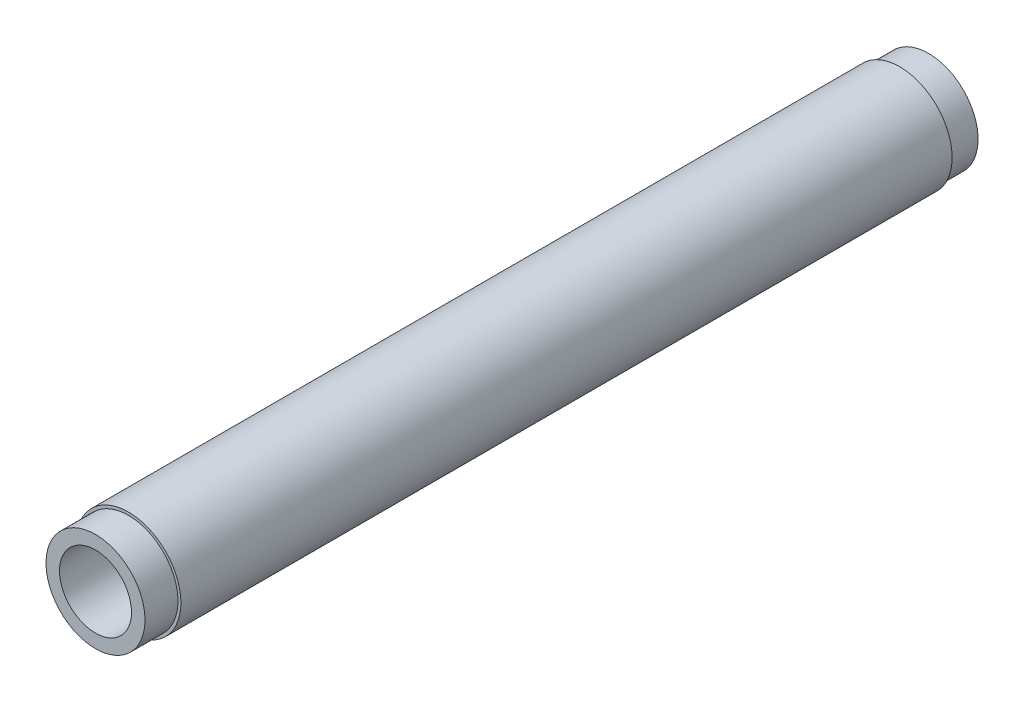
ISO-10303-21;
HEADER;
FILE_DESCRIPTION(('STEP AP214'),'2;1');
FILE_NAME('part.step','',(''),(''),'','','');
FILE_SCHEMA(('AUTOMOTIVE_DESIGN { 1 0 10303 214 1 1 1 1 }'));
ENDSEC;
DATA;
#1=APPLICATION_CONTEXT('core data for automotive mechanical design processes');
#2=APPLICATION_PROTOCOL_DEFINITION('international standard','automotive_design',2000,#1);
#3=PRODUCT_CONTEXT('',#1,'mechanical');
#4=PRODUCT('Part','Part','',(#3));
#5=PRODUCT_RELATED_PRODUCT_CATEGORY('part','',(#4));
#6=PRODUCT_DEFINITION_FORMATION('','',#4);
#7=PRODUCT_DEFINITION_CONTEXT('part definition',#1,'design');
#8=PRODUCT_DEFINITION('design','',#6,#7);
#9=PRODUCT_DEFINITION_SHAPE('','',#8);
#10=(LENGTH_UNIT() NAMED_UNIT(*) SI_UNIT(.MILLI.,.METRE.));
#11=(NAMED_UNIT(*) PLANE_ANGLE_UNIT() SI_UNIT($,.RADIAN.));
#12=(NAMED_UNIT(*) SI_UNIT($,.STERADIAN.) SOLID_ANGLE_UNIT());
#13=UNCERTAINTY_MEASURE_WITH_UNIT(LENGTH_MEASURE(1.E-05),#10,'distance_accuracy_value','');
#14=(GEOMETRIC_REPRESENTATION_CONTEXT(3) GLOBAL_UNCERTAINTY_ASSIGNED_CONTEXT((#13)) GLOBAL_UNIT_ASSIGNED_CONTEXT((#10,
#11,#12)) REPRESENTATION_CONTEXT('',''));
#15=CARTESIAN_POINT('',(0.,0.,0.));
#16=DIRECTION('',(0.,0.,1.));
#17=DIRECTION('',(1.,0.,0.));
#18=AXIS2_PLACEMENT_3D('',#15,#16,#17);
#19=CARTESIAN_POINT('',(159.099025767245,159.099025766711,45.));
#20=DIRECTION('',(0.,0.,-1.));
#21=DIRECTION('',(-1.,0.,0.));
#22=AXIS2_PLACEMENT_3D('',#19,#20,#21);
#23=CYLINDRICAL_SURFACE('',#22,6.00000000000002);
#24=CARTESIAN_POINT('',(159.099025767245,159.099025766711,45.));
#25=DIRECTION('',(0.,0.,1.));
#26=DIRECTION('',(1.,0.,0.));
#27=AXIS2_PLACEMENT_3D('',#24,#25,#26);
#28=CIRCLE('',#27,6.00000000000002);
#29=CARTESIAN_POINT('',(153.099025767245,159.099025766711,45.));
#30=VERTEX_POINT('',#29);
#31=EDGE_CURVE('E37',#30,#30,#28,.T.);
#32=CARTESIAN_POINT('',(159.099025767245,159.099025766711,41.));
#33=DIRECTION('',(0.,0.,-1.));
#34=DIRECTION('',(-1.,0.,0.));
#35=AXIS2_PLACEMENT_3D('',#32,#33,#34);
#36=CIRCLE('',#35,6.00000000000002);
#37=CARTESIAN_POINT('',(153.099025767245,159.099025766711,41.));
#38=VERTEX_POINT('',#37);
#39=EDGE_CURVE('E10',#38,#38,#36,.T.);
#40=CARTESIAN_POINT('',(153.099025767245,159.099025766711,45.));
#41=CARTESIAN_POINT('',(153.099025767245,159.099025766711,44.9583333333333));
#42=CARTESIAN_POINT('',(153.099025767245,159.099025766711,44.9166666666667));
#43=CARTESIAN_POINT('',(153.099025767245,159.099025766711,44.8333333333333));
#44=CARTESIAN_POINT('',(153.099025767245,159.099025766711,44.7916666666667));
#45=CARTESIAN_POINT('',(153.099025767245,159.099025766711,44.7083333333333));
#46=CARTESIAN_POINT('',(153.099025767245,159.099025766711,44.6666666666667));
#47=CARTESIAN_POINT('',(153.099025767245,159.099025766711,44.5833333333333));
#48=CARTESIAN_POINT('',(153.099025767245,159.099025766711,44.5416666666667));
#49=CARTESIAN_POINT('',(153.099025767245,159.099025766711,44.4583333333333));
#50=CARTESIAN_POINT('',(153.099025767245,159.099025766711,44.4166666666667));
#51=CARTESIAN_POINT('',(153.099025767245,159.099025766711,44.3333333333333));
#52=CARTESIAN_POINT('',(153.099025767245,159.099025766711,44.2916666666667));
#53=CARTESIAN_POINT('',(153.099025767245,159.099025766711,44.2083333333333));
#54=CARTESIAN_POINT('',(153.099025767245,159.099025766711,44.1666666666667));
#55=CARTESIAN_POINT('',(153.099025767245,159.099025766711,44.0833333333333));
#56=CARTESIAN_POINT('',(153.099025767245,159.099025766711,44.0416666666667));
#57=CARTESIAN_POINT('',(153.099025767245,159.099025766711,43.9583333333333));
#58=CARTESIAN_POINT('',(153.099025767245,159.099025766711,43.9166666666667));
#59=CARTESIAN_POINT('',(153.099025767245,159.099025766711,43.8333333333333));
#60=CARTESIAN_POINT('',(153.099025767245,159.099025766711,43.7916666666667));
#61=CARTESIAN_POINT('',(153.099025767245,159.099025766711,43.7083333333333));
#62=CARTESIAN_POINT('',(153.099025767245,159.099025766711,43.6666666666667));
#63=CARTESIAN_POINT('',(153.099025767245,159.099025766711,43.5833333333333));
#64=CARTESIAN_POINT('',(153.099025767245,159.099025766711,43.5416666666667));
#65=CARTESIAN_POINT('',(153.099025767245,159.099025766711,43.4583333333333));
#66=CARTESIAN_POINT('',(153.099025767245,159.099025766711,43.4166666666667));
#67=CARTESIAN_POINT('',(153.099025767245,159.099025766711,43.3333333333333));
#68=CARTESIAN_POINT('',(153.099025767245,159.099025766711,43.2916666666667));
#69=CARTESIAN_POINT('',(153.099025767245,159.099025766711,43.2083333333333));
#70=CARTESIAN_POINT('',(153.099025767245,159.099025766711,43.1666666666667));
#71=CARTESIAN_POINT('',(153.099025767245,159.099025766711,43.0833333333333));
#72=CARTESIAN_POINT('',(153.099025767245,159.099025766711,43.0416666666667));
#73=CARTESIAN_POINT('',(153.099025767245,159.099025766711,42.9583333333333));
#74=CARTESIAN_POINT('',(153.099025767245,159.099025766711,42.9166666666667));
#75=CARTESIAN_POINT('',(153.099025767245,159.099025766711,42.8333333333333));
#76=CARTESIAN_POINT('',(153.099025767245,159.099025766711,42.7916666666667));
#77=CARTESIAN_POINT('',(153.099025767245,159.099025766711,42.7083333333333));
#78=CARTESIAN_POINT('',(153.099025767245,159.099025766711,42.6666666666667));
#79=CARTESIAN_POINT('',(153.099025767245,159.099025766711,42.5833333333333));
#80=CARTESIAN_POINT('',(153.099025767245,159.099025766711,42.5416666666667));
#81=CARTESIAN_POINT('',(153.099025767245,159.099025766711,42.4583333333333));
#82=CARTESIAN_POINT('',(153.099025767245,159.099025766711,42.4166666666667));
#83=CARTESIAN_POINT('',(153.099025767245,159.099025766711,42.3333333333333));
#84=CARTESIAN_POINT('',(153.099025767245,159.099025766711,42.2916666666667));
#85=CARTESIAN_POINT('',(153.099025767245,159.099025766711,42.2083333333333));
#86=CARTESIAN_POINT('',(153.099025767245,159.099025766711,42.1666666666667));
#87=CARTESIAN_POINT('',(153.099025767245,159.099025766711,42.0833333333333));
#88=CARTESIAN_POINT('',(153.099025767245,159.099025766711,42.0416666666667));
#89=CARTESIAN_POINT('',(153.099025767245,159.099025766711,41.9583333333333));
#90=CARTESIAN_POINT('',(153.099025767245,159.099025766711,41.9166666666667));
#91=CARTESIAN_POINT('',(153.099025767245,159.099025766711,41.8333333333333));
#92=CARTESIAN_POINT('',(153.099025767245,159.099025766711,41.7916666666667));
#93=CARTESIAN_POINT('',(153.099025767245,159.099025766711,41.7083333333333));
#94=CARTESIAN_POINT('',(153.099025767245,159.099025766711,41.6666666666667));
#95=CARTESIAN_POINT('',(153.099025767245,159.099025766711,41.5833333333333));
#96=CARTESIAN_POINT('',(153.099025767245,159.099025766711,41.5416666666667));
#97=CARTESIAN_POINT('',(153.099025767245,159.099025766711,41.4583333333333));
#98=CARTESIAN_POINT('',(153.099025767245,159.099025766711,41.4166666666667));
#99=CARTESIAN_POINT('',(153.099025767245,159.099025766711,41.3333333333333));
#100=CARTESIAN_POINT('',(153.099025767245,159.099025766711,41.2916666666667));
#101=CARTESIAN_POINT('',(153.099025767245,159.099025766711,41.2083333333333));
#102=CARTESIAN_POINT('',(153.099025767245,159.099025766711,41.1666666666667));
#103=CARTESIAN_POINT('',(153.099025767245,159.099025766711,41.0833333333333));
#104=CARTESIAN_POINT('',(153.099025767245,159.099025766711,41.0416666666667));
#105=CARTESIAN_POINT('',(153.099025767245,159.099025766711,41.));
#106=B_SPLINE_CURVE_WITH_KNOTS('',3,(#40,#41,#42,#43,#44,#45,#46,#47,#48,#49,#50,#51,#52,#53,
#54,#55,#56,#57,#58,#59,#60,#61,#62,#63,#64,#65,#66,#67,#68,#69,#70,#71,#72,#73,#74,#75,#76,#77,
#78,#79,#80,#81,#82,#83,#84,#85,#86,#87,#88,#89,#90,#91,#92,#93,#94,#95,#96,#97,#98,#99,#100,
#101,#102,#103,#104,#105),.UNSPECIFIED.,.F.,.F.,(4,2,2,2,2,2,2,2,2,2,2,2,2,2,2,2,2,2,2,2,2,2,2,
2,2,2,2,2,2,2,2,2,4),(0.,0.124999999999993,0.249999999999993,0.374999999999993,
0.499999999999994,0.624999999999994,0.749999999999994,0.874999999999994,0.999999999999994,
1.12499999999999,1.24999999999999,1.37499999999999,1.49999999999999,1.62499999999999,
1.74999999999999,1.87499999999999,1.99999999999999,2.125,2.24999999999999,2.37499999999999,
2.49999999999999,2.62499999999999,2.74999999999999,2.87499999999999,2.99999999999999,
3.12499999999999,3.24999999999999,3.37499999999999,3.49999999999999,3.62499999999999,
3.74999999999999,3.87499999999999,3.99999999999999),.UNSPECIFIED.);
#107=EDGE_CURVE('BSEAM27',#30,#38,#106,.T.);
#108=ORIENTED_EDGE('',*,*,#31,.F.);
#109=ORIENTED_EDGE('',*,*,#39,.F.);
#110=ORIENTED_EDGE('',*,*,#107,.T.);
#111=ORIENTED_EDGE('',*,*,#107,.F.);
#112=EDGE_LOOP('',(#108,#110,#109,#111));
#113=FACE_BOUND('',#112,.T.);
#114=ADVANCED_FACE('F27',(#113),#23,.T.);
#115=CARTESIAN_POINT('',(159.099025767245,159.099025766711,45.));
#116=DIRECTION('',(0.,0.,1.));
#117=DIRECTION('',(1.,0.,0.));
#118=AXIS2_PLACEMENT_3D('',#115,#116,#117);
#119=PLANE('',#118);
#120=CARTESIAN_POINT('',(159.099025767245,159.099025766711,45.));
#121=DIRECTION('',(0.,0.,1.));
#122=DIRECTION('',(1.,0.,0.));
#123=AXIS2_PLACEMENT_3D('',#120,#121,#122);
#124=CIRCLE('',#123,4.36499999999997);
#125=CARTESIAN_POINT('',(163.464025767245,159.099025766711,45.));
#126=VERTEX_POINT('',#125);
#127=EDGE_CURVE('E55',#126,#126,#124,.T.);
#128=ORIENTED_EDGE('',*,*,#127,.F.);
#129=EDGE_LOOP('',(#128));
#130=FACE_BOUND('',#129,.T.);
#131=ORIENTED_EDGE('',*,*,#31,.T.);
#132=EDGE_LOOP('',(#131));
#133=FACE_BOUND('',#132,.T.);
#134=ADVANCED_FACE('F61',(#130,#133),#119,.T.);
#135=CARTESIAN_POINT('',(-6.65989041315899,63.9949483309612,41.));
#136=DIRECTION('',(0.,0.,-1.));
#137=DIRECTION('',(-1.,0.,0.));
#138=AXIS2_PLACEMENT_3D('',#135,#136,#137);
#139=PLANE('',#138);
#140=CARTESIAN_POINT('',(159.099025767245,159.099025766711,41.));
#141=DIRECTION('',(0.,0.,-1.));
#142=DIRECTION('',(-1.,0.,0.));
#143=AXIS2_PLACEMENT_3D('',#140,#141,#142);
#144=CIRCLE('',#143,6.34999999999999);
#145=CARTESIAN_POINT('',(152.749025767245,159.099025766711,41.));
#146=VERTEX_POINT('',#145);
#147=EDGE_CURVE('E46',#146,#146,#144,.T.);
#148=ORIENTED_EDGE('',*,*,#147,.F.);
#149=EDGE_LOOP('',(#148));
#150=FACE_BOUND('',#149,.T.);
#151=ORIENTED_EDGE('',*,*,#39,.T.);
#152=EDGE_LOOP('',(#151));
#153=FACE_BOUND('',#152,.T.);
#154=ADVANCED_FACE('F64',(#150,#153),#139,.F.);
#155=CARTESIAN_POINT('',(199.49168805488,-8.55210885711002,-52.5));
#156=DIRECTION('',(0.,0.,1.));
#157=DIRECTION('',(1.,0.,0.));
#158=AXIS2_PLACEMENT_3D('',#155,#156,#157);
#159=PLANE('',#158);
#160=CARTESIAN_POINT('',(159.099025767245,159.099025766711,-52.5));
#161=DIRECTION('',(0.,0.,1.));
#162=DIRECTION('',(1.,0.,0.));
#163=AXIS2_PLACEMENT_3D('',#160,#161,#162);
#164=CIRCLE('',#163,6.34999999999999);
#165=CARTESIAN_POINT('',(165.449025767245,159.099025766711,-52.5));
#166=VERTEX_POINT('',#165);
#167=EDGE_CURVE('E49',#166,#166,#164,.F.);
#168=ORIENTED_EDGE('',*,*,#167,.T.);
#169=EDGE_LOOP('',(#168));
#170=FACE_BOUND('',#169,.T.);
#171=CARTESIAN_POINT('',(159.099025767245,159.099025766711,-52.5));
#172=DIRECTION('',(0.,0.,1.));
#173=DIRECTION('',(1.,0.,0.));
#174=AXIS2_PLACEMENT_3D('',#171,#172,#173);
#175=CIRCLE('',#174,6.00000000000002);
#176=CARTESIAN_POINT('',(153.099025767245,159.099025766711,-52.5));
#177=VERTEX_POINT('',#176);
#178=EDGE_CURVE('E33',#177,#177,#175,.T.);
#179=ORIENTED_EDGE('',*,*,#178,.T.);
#180=EDGE_LOOP('',(#179));
#181=FACE_BOUND('',#180,.T.);
#182=ADVANCED_FACE('F91',(#170,#181),#159,.F.);
#183=CARTESIAN_POINT('',(159.099025767245,159.099025766711,58.9605122421383));
#184=DIRECTION('',(0.,0.,-1.));
#185=DIRECTION('',(-1.,0.,0.));
#186=AXIS2_PLACEMENT_3D('',#183,#184,#185);
#187=CYLINDRICAL_SURFACE('',#186,6.34999999999999);
#188=ORIENTED_EDGE('',*,*,#147,.T.);
#189=EDGE_LOOP('',(#188));
#190=FACE_BOUND('',#189,.T.);
#191=ORIENTED_EDGE('',*,*,#167,.F.);
#192=EDGE_LOOP('',(#191));
#193=FACE_BOUND('',#192,.T.);
#194=ADVANCED_FACE('F83',(#190,#193),#187,.T.);
#195=CARTESIAN_POINT('',(159.099025767245,159.099025766711,-56.));
#196=DIRECTION('',(0.,0.,1.));
#197=DIRECTION('',(1.,0.,0.));
#198=AXIS2_PLACEMENT_3D('',#195,#196,#197);
#199=PLANE('',#198);
#200=CARTESIAN_POINT('',(159.099025767245,159.099025766711,-56.));
#201=DIRECTION('',(0.,0.,1.));
#202=DIRECTION('',(1.,0.,0.));
#203=AXIS2_PLACEMENT_3D('',#200,#201,#202);
#204=CIRCLE('',#203,4.36499999999997);
#205=CARTESIAN_POINT('',(163.464025767245,159.099025766711,-56.));
#206=VERTEX_POINT('',#205);
#207=EDGE_CURVE('E52',#206,#206,#204,.T.);
#208=ORIENTED_EDGE('',*,*,#207,.T.);
#209=EDGE_LOOP('',(#208));
#210=FACE_BOUND('',#209,.T.);
#211=CARTESIAN_POINT('',(159.099025767245,159.099025766711,-56.));
#212=DIRECTION('',(0.,0.,1.));
#213=DIRECTION('',(1.,0.,0.));
#214=AXIS2_PLACEMENT_3D('',#211,#212,#213);
#215=CIRCLE('',#214,6.00000000000002);
#216=CARTESIAN_POINT('',(153.099025767245,159.099025766711,-56.));
#217=VERTEX_POINT('',#216);
#218=EDGE_CURVE('E41',#217,#217,#215,.T.);
#219=ORIENTED_EDGE('',*,*,#218,.F.);
#220=EDGE_LOOP('',(#219));
#221=FACE_BOUND('',#220,.T.);
#222=ADVANCED_FACE('F74',(#210,#221),#199,.F.);
#223=CARTESIAN_POINT('',(153.099025767245,159.099025766711,-56.));
#224=CARTESIAN_POINT('',(153.099025767245,159.099025766711,-55.9635416666667));
#225=CARTESIAN_POINT('',(153.099025767245,159.099025766711,-55.9270833333333));
#226=CARTESIAN_POINT('',(153.099025767245,159.099025766711,-55.8541666666667));
#227=CARTESIAN_POINT('',(153.099025767245,159.099025766711,-55.8177083333333));
#228=CARTESIAN_POINT('',(153.099025767245,159.099025766711,-55.7447916666667));
#229=CARTESIAN_POINT('',(153.099025767245,159.099025766711,-55.7083333333333));
#230=CARTESIAN_POINT('',(153.099025767245,159.099025766711,-55.6354166666667));
#231=CARTESIAN_POINT('',(153.099025767245,159.099025766711,-55.5989583333333));
#232=CARTESIAN_POINT('',(153.099025767245,159.099025766711,-55.5260416666667));
#233=CARTESIAN_POINT('',(153.099025767245,159.099025766711,-55.4895833333333));
#234=CARTESIAN_POINT('',(153.099025767245,159.099025766711,-55.4166666666667));
#235=CARTESIAN_POINT('',(153.099025767245,159.099025766711,-55.3802083333333));
#236=CARTESIAN_POINT('',(153.099025767245,159.099025766711,-55.3072916666667));
#237=CARTESIAN_POINT('',(153.099025767245,159.099025766711,-55.2708333333333));
#238=CARTESIAN_POINT('',(153.099025767245,159.099025766711,-55.1979166666667));
#239=CARTESIAN_POINT('',(153.099025767245,159.099025766711,-55.1614583333333));
#240=CARTESIAN_POINT('',(153.099025767245,159.099025766711,-55.0885416666667));
#241=CARTESIAN_POINT('',(153.099025767245,159.099025766711,-55.0520833333333));
#242=CARTESIAN_POINT('',(153.099025767245,159.099025766711,-54.9791666666667));
#243=CARTESIAN_POINT('',(153.099025767245,159.099025766711,-54.9427083333333));
#244=CARTESIAN_POINT('',(153.099025767245,159.099025766711,-54.8697916666667));
#245=CARTESIAN_POINT('',(153.099025767245,159.099025766711,-54.8333333333333));
#246=CARTESIAN_POINT('',(153.099025767245,159.099025766711,-54.7604166666667));
#247=CARTESIAN_POINT('',(153.099025767245,159.099025766711,-54.7239583333333));
#248=CARTESIAN_POINT('',(153.099025767245,159.099025766711,-54.6510416666667));
#249=CARTESIAN_POINT('',(153.099025767245,159.099025766711,-54.6145833333333));
#250=CARTESIAN_POINT('',(153.099025767245,159.099025766711,-54.5416666666667));
#251=CARTESIAN_POINT('',(153.099025767245,159.099025766711,-54.5052083333333));
#252=CARTESIAN_POINT('',(153.099025767245,159.099025766711,-54.4322916666667));
#253=CARTESIAN_POINT('',(153.099025767245,159.099025766711,-54.3958333333333));
#254=CARTESIAN_POINT('',(153.099025767245,159.099025766711,-54.3229166666667));
#255=CARTESIAN_POINT('',(153.099025767245,159.099025766711,-54.2864583333333));
#256=CARTESIAN_POINT('',(153.099025767245,159.099025766711,-54.2135416666667));
#257=CARTESIAN_POINT('',(153.099025767245,159.099025766711,-54.1770833333333));
#258=CARTESIAN_POINT('',(153.099025767245,159.099025766711,-54.1041666666667));
#259=CARTESIAN_POINT('',(153.099025767245,159.099025766711,-54.0677083333333));
#260=CARTESIAN_POINT('',(153.099025767245,159.099025766711,-53.9947916666667));
#261=CARTESIAN_POINT('',(153.099025767245,159.099025766711,-53.9583333333333));
#262=CARTESIAN_POINT('',(153.099025767245,159.099025766711,-53.8854166666667));
#263=CARTESIAN_POINT('',(153.099025767245,159.099025766711,-53.8489583333333));
#264=CARTESIAN_POINT('',(153.099025767245,159.099025766711,-53.7760416666667));
#265=CARTESIAN_POINT('',(153.099025767245,159.099025766711,-53.7395833333333));
#266=CARTESIAN_POINT('',(153.099025767245,159.099025766711,-53.6666666666667));
#267=CARTESIAN_POINT('',(153.099025767245,159.099025766711,-53.6302083333333));
#268=CARTESIAN_POINT('',(153.099025767245,159.099025766711,-53.5572916666667));
#269=CARTESIAN_POINT('',(153.099025767245,159.099025766711,-53.5208333333333));
#270=CARTESIAN_POINT('',(153.099025767245,159.099025766711,-53.4479166666667));
#271=CARTESIAN_POINT('',(153.099025767245,159.099025766711,-53.4114583333333));
#272=CARTESIAN_POINT('',(153.099025767245,159.099025766711,-53.3385416666667));
#273=CARTESIAN_POINT('',(153.099025767245,159.099025766711,-53.3020833333333));
#274=CARTESIAN_POINT('',(153.099025767245,159.099025766711,-53.2291666666667));
#275=CARTESIAN_POINT('',(153.099025767245,159.099025766711,-53.1927083333333));
#276=CARTESIAN_POINT('',(153.099025767245,159.099025766711,-53.1197916666667));
#277=CARTESIAN_POINT('',(153.099025767245,159.099025766711,-53.0833333333333));
#278=CARTESIAN_POINT('',(153.099025767245,159.099025766711,-53.0104166666667));
#279=CARTESIAN_POINT('',(153.099025767245,159.099025766711,-52.9739583333333));
#280=CARTESIAN_POINT('',(153.099025767245,159.099025766711,-52.9010416666667));
#281=CARTESIAN_POINT('',(153.099025767245,159.099025766711,-52.8645833333333));
#282=CARTESIAN_POINT('',(153.099025767245,159.099025766711,-52.7916666666667));
#283=CARTESIAN_POINT('',(153.099025767245,159.099025766711,-52.7552083333333));
#284=CARTESIAN_POINT('',(153.099025767245,159.099025766711,-52.6822916666667));
#285=CARTESIAN_POINT('',(153.099025767245,159.099025766711,-52.6458333333333));
#286=CARTESIAN_POINT('',(153.099025767245,159.099025766711,-52.5729166666667));
#287=CARTESIAN_POINT('',(153.099025767245,159.099025766711,-52.5364583333333));
#288=CARTESIAN_POINT('',(153.099025767245,159.099025766711,-52.5));
#289=B_SPLINE_CURVE_WITH_KNOTS('',3,(#223,#224,#225,#226,#227,#228,#229,#230,#231,#232,#233,
#234,#235,#236,#237,#238,#239,#240,#241,#242,#243,#244,#245,#246,#247,#248,#249,#250,#251,#252,
#253,#254,#255,#256,#257,#258,#259,#260,#261,#262,#263,#264,#265,#266,#267,#268,#269,#270,#271,
#272,#273,#274,#275,#276,#277,#278,#279,#280,#281,#282,#283,#284,#285,#286,#287,#288),
.UNSPECIFIED.,.F.,.F.,(4,2,2,2,2,2,2,2,2,2,2,2,2,2,2,2,2,2,2,2,2,2,2,2,2,2,2,2,2,2,2,2,4),(0.,
0.109374999999995,0.218750000000004,0.328124999999999,0.437500000000007,0.546875000000002,
0.656249999999997,0.765625000000006,0.875000000000001,0.984374999999996,1.09375,1.203125,
1.31249999999999,1.421875,1.53125,1.64062500000001,1.75,1.859375,1.96875000000001,2.078125,
2.18750000000001,2.296875,2.40625,2.51562500000001,2.625,2.734375,2.84375000000001,2.953125,
3.0625,3.171875,3.28125,3.39062500000001,3.5),.UNSPECIFIED.);
#290=EDGE_CURVE('BSEAM69',#217,#177,#289,.T.);
#291=ORIENTED_EDGE('',*,*,#218,.T.);
#292=ORIENTED_EDGE('',*,*,#178,.F.);
#293=ORIENTED_EDGE('',*,*,#290,.T.);
#294=ORIENTED_EDGE('',*,*,#290,.F.);
#295=EDGE_LOOP('',(#291,#293,#292,#294));
#296=FACE_BOUND('',#295,.T.);
#297=ADVANCED_FACE('F69',(#296),#23,.T.);
#298=CARTESIAN_POINT('',(159.099025767245,159.099025766711,-56.));
#299=DIRECTION('',(0.,0.,1.));
#300=DIRECTION('',(1.,0.,0.));
#301=AXIS2_PLACEMENT_3D('',#298,#299,#300);
#302=CYLINDRICAL_SURFACE('',#301,4.36499999999997);
#303=ORIENTED_EDGE('',*,*,#207,.F.);
#304=EDGE_LOOP('',(#303));
#305=FACE_BOUND('',#304,.T.);
#306=ORIENTED_EDGE('',*,*,#127,.T.);
#307=EDGE_LOOP('',(#306));
#308=FACE_BOUND('',#307,.T.);
#309=ADVANCED_FACE('F59',(#305,#308),#302,.F.);
#310=CLOSED_SHELL('',(#114,#134,#154,#182,#194,#222,#297,#309));
#311=MANIFOLD_SOLID_BREP('B2',#310);
#312=ADVANCED_BREP_SHAPE_REPRESENTATION('',(#18,#311),#14);
#313=SHAPE_DEFINITION_REPRESENTATION(#9,#312);
ENDSEC;
END-ISO-10303-21;
